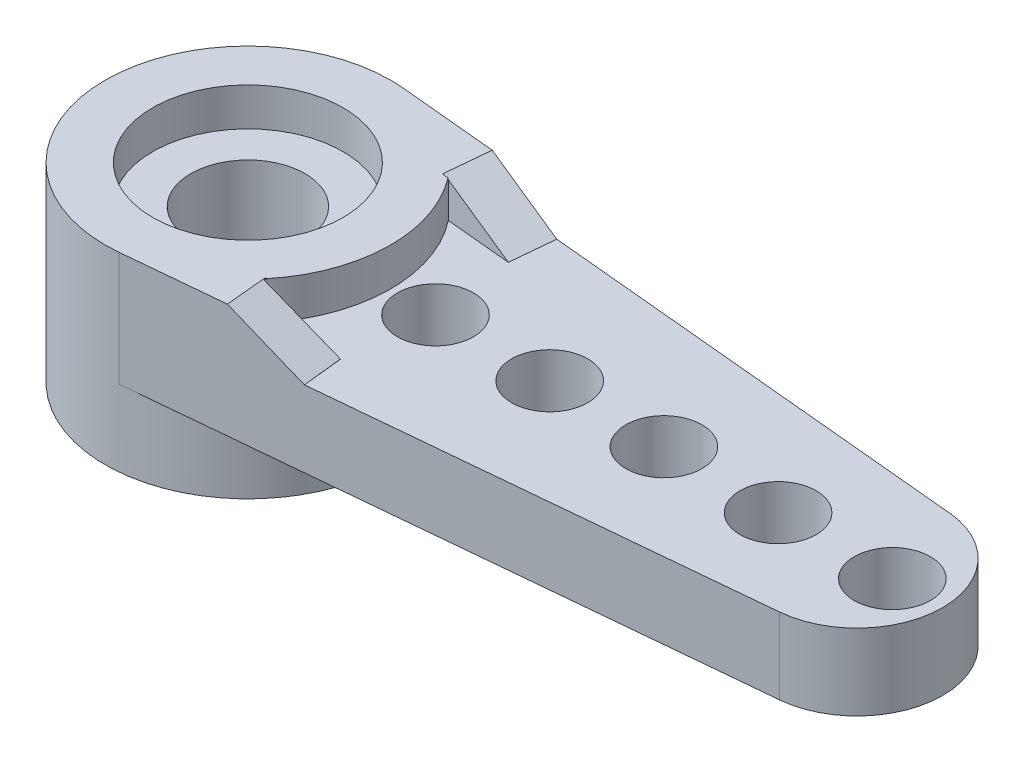
ISO-10303-21;
HEADER;
FILE_DESCRIPTION(('STEP AP214'),'2;1');
FILE_NAME('part.step','',(''),(''),'','','');
FILE_SCHEMA(('AUTOMOTIVE_DESIGN { 1 0 10303 214 1 1 1 1 }'));
ENDSEC;
DATA;
#1=APPLICATION_CONTEXT('core data for automotive mechanical design processes');
#2=APPLICATION_PROTOCOL_DEFINITION('international standard','automotive_design',2000,#1);
#3=PRODUCT_CONTEXT('',#1,'mechanical');
#4=PRODUCT('Part','Part','',(#3));
#5=PRODUCT_RELATED_PRODUCT_CATEGORY('part','',(#4));
#6=PRODUCT_DEFINITION_FORMATION('','',#4);
#7=PRODUCT_DEFINITION_CONTEXT('part definition',#1,'design');
#8=PRODUCT_DEFINITION('design','',#6,#7);
#9=PRODUCT_DEFINITION_SHAPE('','',#8);
#10=(LENGTH_UNIT() NAMED_UNIT(*) SI_UNIT(.MILLI.,.METRE.));
#11=(NAMED_UNIT(*) PLANE_ANGLE_UNIT() SI_UNIT($,.RADIAN.));
#12=(NAMED_UNIT(*) SI_UNIT($,.STERADIAN.) SOLID_ANGLE_UNIT());
#13=UNCERTAINTY_MEASURE_WITH_UNIT(LENGTH_MEASURE(1.E-05),#10,'distance_accuracy_value','');
#14=(GEOMETRIC_REPRESENTATION_CONTEXT(3) GLOBAL_UNCERTAINTY_ASSIGNED_CONTEXT((#13)) GLOBAL_UNIT_ASSIGNED_CONTEXT((#10,
#11,#12)) REPRESENTATION_CONTEXT('',''));
#15=CARTESIAN_POINT('',(0.,0.,0.));
#16=DIRECTION('',(0.,0.,1.));
#17=DIRECTION('',(1.,0.,0.));
#18=AXIS2_PLACEMENT_3D('',#15,#16,#17);
#19=CARTESIAN_POINT('',(0.,2.,0.));
#20=DIRECTION('',(0.,-1.,0.));
#21=DIRECTION('',(0.,0.,-1.));
#22=AXIS2_PLACEMENT_3D('',#19,#20,#21);
#23=CYLINDRICAL_SURFACE('',#22,3.75);
#24=CARTESIAN_POINT('',(0.,-2.,0.));
#25=DIRECTION('',(0.,-1.,0.));
#26=DIRECTION('',(0.,0.,-1.));
#27=AXIS2_PLACEMENT_3D('',#24,#25,#26);
#28=CIRCLE('',#27,3.75);
#29=CARTESIAN_POINT('',(0.,-2.,-3.75));
#30=VERTEX_POINT('',#29);
#31=EDGE_CURVE('E247',#30,#30,#28,.T.);
#32=ORIENTED_EDGE('',*,*,#31,.F.);
#33=EDGE_LOOP('',(#32));
#34=FACE_BOUND('',#33,.T.);
#35=DIRECTION('',(0.,-1.,0.));
#36=VECTOR('',#35,1.);
#37=CARTESIAN_POINT('',(0.3515625,2.,3.73348413798609));
#38=LINE('',#37,#36);
#39=CARTESIAN_POINT('',(0.3515625,3.,3.73348413798609));
#40=VERTEX_POINT('',#39);
#41=CARTESIAN_POINT('',(0.3515625,0.,3.73348413798609));
#42=VERTEX_POINT('',#41);
#43=EDGE_CURVE('E45',#40,#42,#38,.T.);
#44=ORIENTED_EDGE('',*,*,#43,.F.);
#45=CARTESIAN_POINT('',(0.,3.,0.));
#46=DIRECTION('',(0.,1.,0.));
#47=DIRECTION('',(0.,0.,1.));
#48=AXIS2_PLACEMENT_3D('',#45,#46,#47);
#49=CIRCLE('',#48,3.75);
#50=CARTESIAN_POINT('',(0.3515625,3.,-3.73348413798609));
#51=VERTEX_POINT('',#50);
#52=EDGE_CURVE('E258',#51,#40,#49,.T.);
#53=ORIENTED_EDGE('',*,*,#52,.F.);
#54=DIRECTION('',(0.,-1.,0.));
#55=VECTOR('',#54,1.);
#56=CARTESIAN_POINT('',(0.3515625,2.,-3.73348413798609));
#57=LINE('',#56,#55);
#58=CARTESIAN_POINT('',(0.3515625,0.,-3.73348413798609));
#59=VERTEX_POINT('',#58);
#60=EDGE_CURVE('E273',#51,#59,#57,.T.);
#61=ORIENTED_EDGE('',*,*,#60,.T.);
#62=CARTESIAN_POINT('',(0.,0.,0.));
#63=DIRECTION('',(0.,-1.,0.));
#64=DIRECTION('',(0.,0.,-1.));
#65=AXIS2_PLACEMENT_3D('',#62,#63,#64);
#66=CIRCLE('',#65,3.75);
#67=EDGE_CURVE('E244',#59,#42,#66,.T.);
#68=ORIENTED_EDGE('',*,*,#67,.T.);
#69=EDGE_LOOP('',(#44,#53,#61,#68));
#70=FACE_BOUND('',#69,.T.);
#71=ADVANCED_FACE('F38',(#34,#70),#23,.T.);
#72=DIRECTION('',(0.,-1.,0.));
#73=VECTOR('',#72,1.);
#74=CARTESIAN_POINT('',(2.95007757756407,3.,-2.31506852735588));
#75=LINE('',#74,#73);
#76=CARTESIAN_POINT('',(2.95007757756407,2.92895565400102,-2.31506852735588));
#77=VERTEX_POINT('',#76);
#78=CARTESIAN_POINT('',(2.95007757756407,2.,-2.31506852735588));
#79=VERTEX_POINT('',#78);
#80=EDGE_CURVE('E198',#77,#79,#75,.T.);
#81=ORIENTED_EDGE('',*,*,#80,.F.);
#82=CARTESIAN_POINT('',(0.,4.37509868074712,0.));
#83=DIRECTION('',(-0.467370729085676,-0.882965308487425,-0.0440098352829255));
#84=DIRECTION('',(0.879076526301279,-0.469438243017872,0.0827779976706961));
#85=AXIS2_PLACEMENT_3D('',#82,#83,#84);
#86=ELLIPSE('',#85,4.24705247641494,3.75);
#87=CARTESIAN_POINT('',(2.97649828691811,2.91327253963519,-2.28099933098928));
#88=VERTEX_POINT('',#87);
#89=EDGE_CURVE('E163',#77,#88,#86,.T.);
#90=ORIENTED_EDGE('',*,*,#89,.T.);
#91=DIRECTION('',(0.,-1.,0.));
#92=VECTOR('',#91,1.);
#93=CARTESIAN_POINT('',(2.97649828691811,2.,-2.28099933098928));
#94=LINE('',#93,#92);
#95=CARTESIAN_POINT('',(2.97649828691811,3.,-2.28099933098928));
#96=VERTEX_POINT('',#95);
#97=EDGE_CURVE('E140',#96,#88,#94,.T.);
#98=ORIENTED_EDGE('',*,*,#97,.F.);
#99=CARTESIAN_POINT('',(2.89005158990791,3.,2.38958193156685));
#100=VERTEX_POINT('',#99);
#101=EDGE_CURVE('E157',#100,#96,#49,.T.);
#102=ORIENTED_EDGE('',*,*,#101,.F.);
#103=DIRECTION('',(0.,-1.,0.));
#104=VECTOR('',#103,1.);
#105=CARTESIAN_POINT('',(2.89005158990791,2.,2.38958193156685));
#106=LINE('',#105,#104);
#107=CARTESIAN_POINT('',(2.89005158990791,2.97681869407781,2.38958193156685));
#108=VERTEX_POINT('',#107);
#109=EDGE_CURVE('E52',#100,#108,#106,.T.);
#110=ORIENTED_EDGE('',*,*,#109,.T.);
#111=CARTESIAN_POINT('',(0.,4.40557693455155,0.));
#112=DIRECTION('',(-0.472026717856812,-0.880463019866336,0.0444482651762517));
#113=DIRECTION('',(0.876585258334479,-0.474114828546685,-0.0825434081124689));
#114=AXIS2_PLACEMENT_3D('',#111,#112,#113);
#115=ELLIPSE('',#114,4.25912266090323,3.75);
#116=CARTESIAN_POINT('',(2.85116823930113,3.,2.4358447551518));
#117=VERTEX_POINT('',#116);
#118=EDGE_CURVE('E176',#108,#117,#115,.T.);
#119=ORIENTED_EDGE('',*,*,#118,.T.);
#120=CARTESIAN_POINT('',(2.83824462724178,3.,2.45089115138416));
#121=VERTEX_POINT('',#120);
#122=EDGE_CURVE('E262',#121,#117,#49,.T.);
#123=ORIENTED_EDGE('',*,*,#122,.F.);
#124=DIRECTION('',(0.,-1.,0.));
#125=VECTOR('',#124,1.);
#126=CARTESIAN_POINT('',(2.83824462724178,3.,2.45089115138416));
#127=LINE('',#126,#125);
#128=CARTESIAN_POINT('',(2.83824462724178,2.,2.45089115138416));
#129=VERTEX_POINT('',#128);
#130=EDGE_CURVE('E187',#121,#129,#127,.T.);
#131=ORIENTED_EDGE('',*,*,#130,.T.);
#132=CARTESIAN_POINT('',(0.,2.,0.));
#133=DIRECTION('',(0.,1.,0.));
#134=DIRECTION('',(0.,0.,1.));
#135=AXIS2_PLACEMENT_3D('',#132,#133,#134);
#136=CIRCLE('',#135,3.75);
#137=EDGE_CURVE('E255',#129,#79,#136,.T.);
#138=ORIENTED_EDGE('',*,*,#137,.T.);
#139=EDGE_LOOP('',(#81,#90,#98,#102,#110,#119,#123,#131,#138));
#140=FACE_BOUND('',#139,.T.);
#141=ADVANCED_FACE('F330',(#140),#23,.T.);
#142=CARTESIAN_POINT('',(0.,2.,0.));
#143=DIRECTION('',(0.,1.,0.));
#144=DIRECTION('',(0.,0.,1.));
#145=AXIS2_PLACEMENT_3D('',#142,#143,#144);
#146=PLANE('',#145);
#147=DIRECTION('',(0.0937500000000001,0.,-0.995595770129624));
#148=VECTOR('',#147,1.);
#149=CARTESIAN_POINT('',(4.79920503647405,2.,-3.31467311015283));
#150=LINE('',#149,#148);
#151=CARTESIAN_POINT('',(4.68965274331396,2.,-2.15126191358549));
#152=VERTEX_POINT('',#151);
#153=CARTESIAN_POINT('',(4.79920503647405,2.,-3.31467311015283));
#154=VERTEX_POINT('',#153);
#155=EDGE_CURVE('E199',#152,#154,#150,.T.);
#156=ORIENTED_EDGE('',*,*,#155,.F.);
#157=DIRECTION('',(0.995595770129624,0.,0.09375));
#158=VECTOR('',#157,1.);
#159=CARTESIAN_POINT('',(4.68965274331396,2.,-2.15126191358549));
#160=LINE('',#159,#158);
#161=EDGE_CURVE('E195',#79,#152,#160,.T.);
#162=ORIENTED_EDGE('',*,*,#161,.F.);
#163=ORIENTED_EDGE('',*,*,#137,.F.);
#164=DIRECTION('',(-0.994660521333252,0.,0.103201004360725));
#165=VECTOR('',#164,1.);
#166=CARTESIAN_POINT('',(4.68965274331396,2.,2.25879829863462));
#167=LINE('',#166,#165);
#168=CARTESIAN_POINT('',(4.68965274331396,2.,2.25879829863462));
#169=VERTEX_POINT('',#168);
#170=EDGE_CURVE('E185',#169,#129,#167,.T.);
#171=ORIENTED_EDGE('',*,*,#170,.F.);
#172=DIRECTION('',(-0.103201004360725,0.,-0.994660521333253));
#173=VECTOR('',#172,1.);
#174=CARTESIAN_POINT('',(4.79920503647405,2.,3.31467311015283));
#175=LINE('',#174,#173);
#176=CARTESIAN_POINT('',(4.79920503647405,2.,3.31467311015283));
#177=VERTEX_POINT('',#176);
#178=EDGE_CURVE('E180',#177,#169,#175,.T.);
#179=ORIENTED_EDGE('',*,*,#178,.F.);
#180=DIRECTION('',(0.995595770129625,0.,-0.0937499999999999));
#181=VECTOR('',#180,1.);
#182=CARTESIAN_POINT('',(0.3515625,2.,3.73348413798609));
#183=LINE('',#182,#181);
#184=CARTESIAN_POINT('',(16.2109375,2.,2.24009048279166));
#185=VERTEX_POINT('',#184);
#186=EDGE_CURVE('E265',#177,#185,#183,.T.);
#187=ORIENTED_EDGE('',*,*,#186,.T.);
#188=CARTESIAN_POINT('',(16.,2.,0.));
#189=DIRECTION('',(0.,1.,0.));
#190=DIRECTION('',(0.,0.,1.));
#191=AXIS2_PLACEMENT_3D('',#188,#189,#190);
#192=CIRCLE('',#191,2.25);
#193=CARTESIAN_POINT('',(16.2109375,2.,-2.24009048279166));
#194=VERTEX_POINT('',#193);
#195=EDGE_CURVE('E267',#185,#194,#192,.T.);
#196=ORIENTED_EDGE('',*,*,#195,.T.);
#197=DIRECTION('',(0.995595770129624,0.,0.09375));
#198=VECTOR('',#197,1.);
#199=CARTESIAN_POINT('',(0.3515625,2.,-3.73348413798609));
#200=LINE('',#199,#198);
#201=EDGE_CURVE('E271',#154,#194,#200,.T.);
#202=ORIENTED_EDGE('',*,*,#201,.F.);
#203=EDGE_LOOP('',(#156,#162,#163,#171,#179,#187,#196,#202));
#204=FACE_BOUND('',#203,.T.);
#205=CARTESIAN_POINT('',(4.92748738020224,2.,0.));
#206=DIRECTION('',(0.,1.,0.));
#207=DIRECTION('',(0.,0.,1.));
#208=AXIS2_PLACEMENT_3D('',#205,#206,#207);
#209=CIRCLE('',#208,1.);
#210=CARTESIAN_POINT('',(4.92748738020224,2.,1.));
#211=VERTEX_POINT('',#210);
#212=EDGE_CURVE('E215',#211,#211,#209,.T.);
#213=ORIENTED_EDGE('',*,*,#212,.F.);
#214=EDGE_LOOP('',(#213));
#215=FACE_BOUND('',#214,.T.);
#216=CARTESIAN_POINT('',(7.92748738020224,2.,0.));
#217=DIRECTION('',(0.,1.,0.));
#218=DIRECTION('',(0.,0.,1.));
#219=AXIS2_PLACEMENT_3D('',#216,#217,#218);
#220=CIRCLE('',#219,1.00000000000001);
#221=CARTESIAN_POINT('',(7.92748738020224,2.,1.00000000000001));
#222=VERTEX_POINT('',#221);
#223=EDGE_CURVE('E221',#222,#222,#220,.T.);
#224=ORIENTED_EDGE('',*,*,#223,.F.);
#225=EDGE_LOOP('',(#224));
#226=FACE_BOUND('',#225,.T.);
#227=CARTESIAN_POINT('',(10.9274873802022,2.,0.));
#228=DIRECTION('',(0.,1.,0.));
#229=DIRECTION('',(0.,0.,1.));
#230=AXIS2_PLACEMENT_3D('',#227,#228,#229);
#231=CIRCLE('',#230,1.);
#232=CARTESIAN_POINT('',(10.9274873802022,2.,1.));
#233=VERTEX_POINT('',#232);
#234=EDGE_CURVE('E227',#233,#233,#231,.T.);
#235=ORIENTED_EDGE('',*,*,#234,.F.);
#236=EDGE_LOOP('',(#235));
#237=FACE_BOUND('',#236,.T.);
#238=CARTESIAN_POINT('',(13.9274873802022,2.,0.));
#239=DIRECTION('',(0.,1.,0.));
#240=DIRECTION('',(0.,0.,1.));
#241=AXIS2_PLACEMENT_3D('',#238,#239,#240);
#242=CIRCLE('',#241,1.);
#243=CARTESIAN_POINT('',(13.9274873802022,2.,1.));
#244=VERTEX_POINT('',#243);
#245=EDGE_CURVE('E233',#244,#244,#242,.T.);
#246=ORIENTED_EDGE('',*,*,#245,.F.);
#247=EDGE_LOOP('',(#246));
#248=FACE_BOUND('',#247,.T.);
#249=CARTESIAN_POINT('',(16.9274873802022,2.,0.));
#250=DIRECTION('',(0.,1.,0.));
#251=DIRECTION('',(0.,0.,1.));
#252=AXIS2_PLACEMENT_3D('',#249,#250,#251);
#253=CIRCLE('',#252,1.);
#254=CARTESIAN_POINT('',(16.9274873802022,2.,1.));
#255=VERTEX_POINT('',#254);
#256=EDGE_CURVE('E204',#255,#255,#253,.T.);
#257=ORIENTED_EDGE('',*,*,#256,.F.);
#258=EDGE_LOOP('',(#257));
#259=FACE_BOUND('',#258,.T.);
#260=ADVANCED_FACE('F308',(#204,#215,#226,#237,#248,#259),#146,.T.);
#261=CARTESIAN_POINT('',(0.3515625,2.,3.73348413798609));
#262=DIRECTION('',(-0.0937499999999999,0.,-0.995595770129625));
#263=DIRECTION('',(-0.995595770129625,0.,0.0937499999999999));
#264=AXIS2_PLACEMENT_3D('',#261,#262,#263);
#265=PLANE('',#264);
#266=ORIENTED_EDGE('',*,*,#186,.F.);
#267=DIRECTION('',(0.876585258334479,-0.474114828546685,-0.0825434081124689));
#268=VECTOR('',#267,1.);
#269=CARTESIAN_POINT('',(2.950316949549,3.,3.48877314487541));
#270=LINE('',#269,#268);
#271=CARTESIAN_POINT('',(2.950316949549,3.,3.48877314487541));
#272=VERTEX_POINT('',#271);
#273=EDGE_CURVE('E166',#272,#177,#270,.T.);
#274=ORIENTED_EDGE('',*,*,#273,.F.);
#275=DIRECTION('',(0.995595770129625,0.,-0.0937499999999999));
#276=VECTOR('',#275,1.);
#277=CARTESIAN_POINT('',(0.3515625,3.,3.73348413798609));
#278=LINE('',#277,#276);
#279=EDGE_CURVE('E181',#40,#272,#278,.T.);
#280=ORIENTED_EDGE('',*,*,#279,.F.);
#281=ORIENTED_EDGE('',*,*,#43,.T.);
#282=DIRECTION('',(0.995595770129625,0.,-0.0937499999999999));
#283=VECTOR('',#282,1.);
#284=CARTESIAN_POINT('',(0.3515625,0.,3.73348413798609));
#285=LINE('',#284,#283);
#286=CARTESIAN_POINT('',(16.2109375,0.,2.24009048279166));
#287=VERTEX_POINT('',#286);
#288=EDGE_CURVE('E261',#42,#287,#285,.T.);
#289=ORIENTED_EDGE('',*,*,#288,.T.);
#290=DIRECTION('',(0.,-1.,0.));
#291=VECTOR('',#290,1.);
#292=CARTESIAN_POINT('',(16.2109375,2.,2.24009048279166));
#293=LINE('',#292,#291);
#294=EDGE_CURVE('E284',#185,#287,#293,.T.);
#295=ORIENTED_EDGE('',*,*,#294,.F.);
#296=EDGE_LOOP('',(#266,#274,#280,#281,#289,#295));
#297=FACE_BOUND('',#296,.T.);
#298=ADVANCED_FACE('F290',(#297),#265,.F.);
#299=CARTESIAN_POINT('',(16.,2.,0.));
#300=DIRECTION('',(0.,-1.,0.));
#301=DIRECTION('',(0.,0.,-1.));
#302=AXIS2_PLACEMENT_3D('',#299,#300,#301);
#303=CYLINDRICAL_SURFACE('',#302,2.25);
#304=CARTESIAN_POINT('',(16.,0.,0.));
#305=DIRECTION('',(0.,1.,0.));
#306=DIRECTION('',(0.,0.,1.));
#307=AXIS2_PLACEMENT_3D('',#304,#305,#306);
#308=CIRCLE('',#307,2.25);
#309=CARTESIAN_POINT('',(16.2109375,0.,-2.24009048279166));
#310=VERTEX_POINT('',#309);
#311=EDGE_CURVE('E275',#287,#310,#308,.T.);
#312=ORIENTED_EDGE('',*,*,#311,.T.);
#313=DIRECTION('',(0.,-1.,0.));
#314=VECTOR('',#313,1.);
#315=CARTESIAN_POINT('',(16.2109375,2.,-2.24009048279166));
#316=LINE('',#315,#314);
#317=EDGE_CURVE('E282',#194,#310,#316,.T.);
#318=ORIENTED_EDGE('',*,*,#317,.F.);
#319=ORIENTED_EDGE('',*,*,#195,.F.);
#320=ORIENTED_EDGE('',*,*,#294,.T.);
#321=EDGE_LOOP('',(#312,#318,#319,#320));
#322=FACE_BOUND('',#321,.T.);
#323=ADVANCED_FACE('F303',(#322),#303,.T.);
#324=CARTESIAN_POINT('',(0.3515625,2.,-3.73348413798609));
#325=DIRECTION('',(0.09375,0.,-0.995595770129625));
#326=DIRECTION('',(-0.995595770129625,0.,-0.09375));
#327=AXIS2_PLACEMENT_3D('',#324,#325,#326);
#328=PLANE('',#327);
#329=DIRECTION('',(-0.879076526301279,0.469438243017872,-0.082777997670696));
#330=VECTOR('',#329,1.);
#331=CARTESIAN_POINT('',(2.92659124887556,3.,-3.49100726890935));
#332=LINE('',#331,#330);
#333=CARTESIAN_POINT('',(2.92659124887556,3.,-3.49100726890935));
#334=VERTEX_POINT('',#333);
#335=EDGE_CURVE('E148',#154,#334,#332,.T.);
#336=ORIENTED_EDGE('',*,*,#335,.F.);
#337=ORIENTED_EDGE('',*,*,#201,.T.);
#338=ORIENTED_EDGE('',*,*,#317,.T.);
#339=DIRECTION('',(0.995595770129624,0.,0.09375));
#340=VECTOR('',#339,1.);
#341=CARTESIAN_POINT('',(0.3515625,0.,-3.73348413798609));
#342=LINE('',#341,#340);
#343=EDGE_CURVE('E268',#59,#310,#342,.T.);
#344=ORIENTED_EDGE('',*,*,#343,.F.);
#345=ORIENTED_EDGE('',*,*,#60,.F.);
#346=DIRECTION('',(-0.995595770129625,0.,-0.0937499999999999));
#347=VECTOR('',#346,1.);
#348=CARTESIAN_POINT('',(0.3515625,3.,-3.73348413798609));
#349=LINE('',#348,#347);
#350=EDGE_CURVE('E196',#334,#51,#349,.T.);
#351=ORIENTED_EDGE('',*,*,#350,.F.);
#352=EDGE_LOOP('',(#336,#337,#338,#344,#345,#351));
#353=FACE_BOUND('',#352,.T.);
#354=ADVANCED_FACE('F324',(#353),#328,.T.);
#355=CARTESIAN_POINT('',(0.,0.,0.));
#356=DIRECTION('',(0.,1.,0.));
#357=DIRECTION('',(0.,0.,1.));
#358=AXIS2_PLACEMENT_3D('',#355,#356,#357);
#359=PLANE('',#358);
#360=CARTESIAN_POINT('',(4.92748738020224,0.,0.));
#361=DIRECTION('',(0.,1.,0.));
#362=DIRECTION('',(0.,0.,1.));
#363=AXIS2_PLACEMENT_3D('',#360,#361,#362);
#364=CIRCLE('',#363,1.);
#365=CARTESIAN_POINT('',(4.92748738020224,0.,1.));
#366=VERTEX_POINT('',#365);
#367=EDGE_CURVE('E212',#366,#366,#364,.T.);
#368=ORIENTED_EDGE('',*,*,#367,.T.);
#369=EDGE_LOOP('',(#368));
#370=FACE_BOUND('',#369,.T.);
#371=CARTESIAN_POINT('',(7.92748738020224,0.,0.));
#372=DIRECTION('',(0.,1.,0.));
#373=DIRECTION('',(0.,0.,1.));
#374=AXIS2_PLACEMENT_3D('',#371,#372,#373);
#375=CIRCLE('',#374,1.00000000000001);
#376=CARTESIAN_POINT('',(7.92748738020224,0.,1.00000000000001));
#377=VERTEX_POINT('',#376);
#378=EDGE_CURVE('E218',#377,#377,#375,.T.);
#379=ORIENTED_EDGE('',*,*,#378,.T.);
#380=EDGE_LOOP('',(#379));
#381=FACE_BOUND('',#380,.T.);
#382=CARTESIAN_POINT('',(10.9274873802022,0.,0.));
#383=DIRECTION('',(0.,1.,0.));
#384=DIRECTION('',(0.,0.,1.));
#385=AXIS2_PLACEMENT_3D('',#382,#383,#384);
#386=CIRCLE('',#385,1.);
#387=CARTESIAN_POINT('',(10.9274873802022,0.,1.));
#388=VERTEX_POINT('',#387);
#389=EDGE_CURVE('E224',#388,#388,#386,.T.);
#390=ORIENTED_EDGE('',*,*,#389,.T.);
#391=EDGE_LOOP('',(#390));
#392=FACE_BOUND('',#391,.T.);
#393=CARTESIAN_POINT('',(13.9274873802022,0.,0.));
#394=DIRECTION('',(0.,1.,0.));
#395=DIRECTION('',(0.,0.,1.));
#396=AXIS2_PLACEMENT_3D('',#393,#394,#395);
#397=CIRCLE('',#396,1.);
#398=CARTESIAN_POINT('',(13.9274873802022,0.,1.));
#399=VERTEX_POINT('',#398);
#400=EDGE_CURVE('E230',#399,#399,#397,.T.);
#401=ORIENTED_EDGE('',*,*,#400,.T.);
#402=EDGE_LOOP('',(#401));
#403=FACE_BOUND('',#402,.T.);
#404=CARTESIAN_POINT('',(16.9274873802022,0.,0.));
#405=DIRECTION('',(0.,1.,0.));
#406=DIRECTION('',(0.,0.,1.));
#407=AXIS2_PLACEMENT_3D('',#404,#405,#406);
#408=CIRCLE('',#407,1.);
#409=CARTESIAN_POINT('',(16.9274873802022,0.,1.));
#410=VERTEX_POINT('',#409);
#411=EDGE_CURVE('E236',#410,#410,#408,.T.);
#412=ORIENTED_EDGE('',*,*,#411,.T.);
#413=EDGE_LOOP('',(#412));
#414=FACE_BOUND('',#413,.T.);
#415=ORIENTED_EDGE('',*,*,#67,.F.);
#416=ORIENTED_EDGE('',*,*,#343,.T.);
#417=ORIENTED_EDGE('',*,*,#311,.F.);
#418=ORIENTED_EDGE('',*,*,#288,.F.);
#419=EDGE_LOOP('',(#415,#416,#417,#418));
#420=FACE_BOUND('',#419,.T.);
#421=ADVANCED_FACE('F300',(#370,#381,#392,#403,#414,#420),#359,.F.);
#422=CARTESIAN_POINT('',(0.,3.,0.));
#423=DIRECTION('',(0.,1.,0.));
#424=DIRECTION('',(0.,0.,1.));
#425=AXIS2_PLACEMENT_3D('',#422,#423,#424);
#426=PLANE('',#425);
#427=DIRECTION('',(0.09375,0.,-0.995595770129625));
#428=VECTOR('',#427,1.);
#429=CARTESIAN_POINT('',(2.81409124887556,3.,-2.2962923447538));
#430=LINE('',#429,#428);
#431=CARTESIAN_POINT('',(2.81409124887556,3.,-2.2962923447538));
#432=VERTEX_POINT('',#431);
#433=EDGE_CURVE('E143',#432,#334,#430,.T.);
#434=ORIENTED_EDGE('',*,*,#433,.T.);
#435=ORIENTED_EDGE('',*,*,#350,.T.);
#436=ORIENTED_EDGE('',*,*,#52,.T.);
#437=ORIENTED_EDGE('',*,*,#279,.T.);
#438=DIRECTION('',(0.0937499999999999,0.,0.995595770129625));
#439=VECTOR('',#438,1.);
#440=CARTESIAN_POINT('',(2.847191949549,3.,2.39361779773282));
#441=LINE('',#440,#439);
#442=CARTESIAN_POINT('',(2.85244632755698,3.,2.44941765393983));
#443=VERTEX_POINT('',#442);
#444=EDGE_CURVE('E171',#443,#272,#441,.T.);
#445=ORIENTED_EDGE('',*,*,#444,.F.);
#446=DIRECTION('',(-0.994660521333252,0.,0.103201004360725));
#447=VECTOR('',#446,1.);
#448=CARTESIAN_POINT('',(4.68965274331396,3.,2.25879829863462));
#449=LINE('',#448,#447);
#450=EDGE_CURVE('E184',#443,#121,#449,.T.);
#451=ORIENTED_EDGE('',*,*,#450,.T.);
#452=ORIENTED_EDGE('',*,*,#122,.T.);
#453=CARTESIAN_POINT('',(2.847191949549,3.,2.39361779773282));
#454=VERTEX_POINT('',#453);
#455=EDGE_CURVE('E173',#454,#117,#441,.T.);
#456=ORIENTED_EDGE('',*,*,#455,.F.);
#457=DIRECTION('',(-0.995595770129624,0.,0.0937499999999999));
#458=VECTOR('',#457,1.);
#459=CARTESIAN_POINT('',(4.69608003647405,3.,2.21951776301024));
#460=LINE('',#459,#458);
#461=EDGE_CURVE('E167',#100,#454,#460,.T.);
#462=ORIENTED_EDGE('',*,*,#461,.F.);
#463=ORIENTED_EDGE('',*,*,#101,.T.);
#464=DIRECTION('',(0.995595770129624,0.,0.0937499999999999));
#465=VECTOR('',#464,1.);
#466=CARTESIAN_POINT('',(4.68670503647405,3.,-2.11995818599728));
#467=LINE('',#466,#465);
#468=EDGE_CURVE('E138',#432,#96,#467,.T.);
#469=ORIENTED_EDGE('',*,*,#468,.F.);
#470=EDGE_LOOP('',(#434,#435,#436,#437,#445,#451,#452,#456,#462,#463,#469));
#471=FACE_BOUND('',#470,.T.);
#472=CARTESIAN_POINT('',(0.,3.,0.));
#473=DIRECTION('',(0.,1.,0.));
#474=DIRECTION('',(0.,0.,1.));
#475=AXIS2_PLACEMENT_3D('',#472,#473,#474);
#476=CIRCLE('',#475,2.5);
#477=CARTESIAN_POINT('',(0.,3.,2.5));
#478=VERTEX_POINT('',#477);
#479=EDGE_CURVE('E252',#478,#478,#476,.T.);
#480=ORIENTED_EDGE('',*,*,#479,.F.);
#481=EDGE_LOOP('',(#480));
#482=FACE_BOUND('',#481,.T.);
#483=ADVANCED_FACE('F154',(#471,#482),#426,.T.);
#484=CARTESIAN_POINT('',(0.,3.,0.));
#485=DIRECTION('',(0.,-1.,0.));
#486=DIRECTION('',(0.,0.,-1.));
#487=AXIS2_PLACEMENT_3D('',#484,#485,#486);
#488=CYLINDRICAL_SURFACE('',#487,2.5);
#489=ORIENTED_EDGE('',*,*,#479,.T.);
#490=EDGE_LOOP('',(#489));
#491=FACE_BOUND('',#490,.T.);
#492=CARTESIAN_POINT('',(0.,2.,0.));
#493=DIRECTION('',(0.,1.,0.));
#494=DIRECTION('',(0.,0.,1.));
#495=AXIS2_PLACEMENT_3D('',#492,#493,#494);
#496=CIRCLE('',#495,2.5);
#497=CARTESIAN_POINT('',(0.,2.,2.5));
#498=VERTEX_POINT('',#497);
#499=EDGE_CURVE('E250',#498,#498,#496,.T.);
#500=ORIENTED_EDGE('',*,*,#499,.F.);
#501=EDGE_LOOP('',(#500));
#502=FACE_BOUND('',#501,.T.);
#503=ADVANCED_FACE('F384',(#491,#502),#488,.F.);
#504=CARTESIAN_POINT('',(0.,2.,0.));
#505=DIRECTION('',(0.,1.,0.));
#506=DIRECTION('',(0.,0.,1.));
#507=AXIS2_PLACEMENT_3D('',#504,#505,#506);
#508=CIRCLE('',#507,1.5);
#509=CARTESIAN_POINT('',(0.,2.,1.5));
#510=VERTEX_POINT('',#509);
#511=EDGE_CURVE('E209',#510,#510,#508,.T.);
#512=ORIENTED_EDGE('',*,*,#511,.F.);
#513=EDGE_LOOP('',(#512));
#514=FACE_BOUND('',#513,.T.);
#515=ORIENTED_EDGE('',*,*,#499,.T.);
#516=EDGE_LOOP('',(#515));
#517=FACE_BOUND('',#516,.T.);
#518=ADVANCED_FACE('F356',(#514,#517),#146,.T.);
#519=CARTESIAN_POINT('',(0.,-2.,0.));
#520=DIRECTION('',(0.,-1.,0.));
#521=DIRECTION('',(0.,0.,-1.));
#522=AXIS2_PLACEMENT_3D('',#519,#520,#521);
#523=PLANE('',#522);
#524=ORIENTED_EDGE('',*,*,#31,.T.);
#525=EDGE_LOOP('',(#524));
#526=FACE_BOUND('',#525,.T.);
#527=CARTESIAN_POINT('',(0.,-2.,0.));
#528=DIRECTION('',(0.,-1.,0.));
#529=DIRECTION('',(0.,0.,-1.));
#530=AXIS2_PLACEMENT_3D('',#527,#528,#529);
#531=CIRCLE('',#530,2.5);
#532=CARTESIAN_POINT('',(0.,-2.,-2.5));
#533=VERTEX_POINT('',#532);
#534=EDGE_CURVE('E241',#533,#533,#531,.T.);
#535=ORIENTED_EDGE('',*,*,#534,.F.);
#536=EDGE_LOOP('',(#535));
#537=FACE_BOUND('',#536,.T.);
#538=ADVANCED_FACE('F352',(#526,#537),#523,.T.);
#539=CARTESIAN_POINT('',(0.,-2.,0.));
#540=DIRECTION('',(0.,1.,0.));
#541=DIRECTION('',(0.,0.,1.));
#542=AXIS2_PLACEMENT_3D('',#539,#540,#541);
#543=CYLINDRICAL_SURFACE('',#542,2.5);
#544=ORIENTED_EDGE('',*,*,#534,.T.);
#545=EDGE_LOOP('',(#544));
#546=FACE_BOUND('',#545,.T.);
#547=CARTESIAN_POINT('',(0.,0.,0.));
#548=DIRECTION('',(0.,-1.,0.));
#549=DIRECTION('',(0.,0.,-1.));
#550=AXIS2_PLACEMENT_3D('',#547,#548,#549);
#551=CIRCLE('',#550,2.5);
#552=CARTESIAN_POINT('',(0.,0.,-2.5));
#553=VERTEX_POINT('',#552);
#554=EDGE_CURVE('E208',#553,#553,#551,.T.);
#555=ORIENTED_EDGE('',*,*,#554,.F.);
#556=EDGE_LOOP('',(#555));
#557=FACE_BOUND('',#556,.T.);
#558=ADVANCED_FACE('F355',(#546,#557),#543,.F.);
#559=CARTESIAN_POINT('',(0.,0.,0.));
#560=DIRECTION('',(0.,1.,0.));
#561=DIRECTION('',(0.,0.,1.));
#562=AXIS2_PLACEMENT_3D('',#559,#560,#561);
#563=CIRCLE('',#562,1.5);
#564=CARTESIAN_POINT('',(0.,0.,1.5));
#565=VERTEX_POINT('',#564);
#566=EDGE_CURVE('E205',#565,#565,#563,.T.);
#567=ORIENTED_EDGE('',*,*,#566,.T.);
#568=EDGE_LOOP('',(#567));
#569=FACE_BOUND('',#568,.T.);
#570=ORIENTED_EDGE('',*,*,#554,.T.);
#571=EDGE_LOOP('',(#570));
#572=FACE_BOUND('',#571,.T.);
#573=ADVANCED_FACE('F362',(#569,#572),#359,.F.);
#574=CARTESIAN_POINT('',(16.9274873802022,0.,0.));
#575=DIRECTION('',(0.,1.,0.));
#576=DIRECTION('',(0.,0.,1.));
#577=AXIS2_PLACEMENT_3D('',#574,#575,#576);
#578=CYLINDRICAL_SURFACE('',#577,1.);
#579=ORIENTED_EDGE('',*,*,#411,.F.);
#580=EDGE_LOOP('',(#579));
#581=FACE_BOUND('',#580,.T.);
#582=ORIENTED_EDGE('',*,*,#256,.T.);
#583=EDGE_LOOP('',(#582));
#584=FACE_BOUND('',#583,.T.);
#585=ADVANCED_FACE('F367',(#581,#584),#578,.F.);
#586=CARTESIAN_POINT('',(13.9274873802022,0.,0.));
#587=DIRECTION('',(0.,1.,0.));
#588=DIRECTION('',(0.,0.,1.));
#589=AXIS2_PLACEMENT_3D('',#586,#587,#588);
#590=CYLINDRICAL_SURFACE('',#589,1.);
#591=ORIENTED_EDGE('',*,*,#400,.F.);
#592=EDGE_LOOP('',(#591));
#593=FACE_BOUND('',#592,.T.);
#594=ORIENTED_EDGE('',*,*,#245,.T.);
#595=EDGE_LOOP('',(#594));
#596=FACE_BOUND('',#595,.T.);
#597=ADVANCED_FACE('F373',(#593,#596),#590,.F.);
#598=CARTESIAN_POINT('',(10.9274873802022,0.,0.));
#599=DIRECTION('',(0.,1.,0.));
#600=DIRECTION('',(0.,0.,1.));
#601=AXIS2_PLACEMENT_3D('',#598,#599,#600);
#602=CYLINDRICAL_SURFACE('',#601,1.);
#603=ORIENTED_EDGE('',*,*,#389,.F.);
#604=EDGE_LOOP('',(#603));
#605=FACE_BOUND('',#604,.T.);
#606=ORIENTED_EDGE('',*,*,#234,.T.);
#607=EDGE_LOOP('',(#606));
#608=FACE_BOUND('',#607,.T.);
#609=ADVANCED_FACE('F432',(#605,#608),#602,.F.);
#610=CARTESIAN_POINT('',(7.92748738020224,0.,0.));
#611=DIRECTION('',(0.,1.,0.));
#612=DIRECTION('',(0.,0.,1.));
#613=AXIS2_PLACEMENT_3D('',#610,#611,#612);
#614=CYLINDRICAL_SURFACE('',#613,1.00000000000001);
#615=ORIENTED_EDGE('',*,*,#378,.F.);
#616=EDGE_LOOP('',(#615));
#617=FACE_BOUND('',#616,.T.);
#618=ORIENTED_EDGE('',*,*,#223,.T.);
#619=EDGE_LOOP('',(#618));
#620=FACE_BOUND('',#619,.T.);
#621=ADVANCED_FACE('F424',(#617,#620),#614,.F.);
#622=CARTESIAN_POINT('',(4.92748738020224,0.,0.));
#623=DIRECTION('',(0.,1.,0.));
#624=DIRECTION('',(0.,0.,1.));
#625=AXIS2_PLACEMENT_3D('',#622,#623,#624);
#626=CYLINDRICAL_SURFACE('',#625,1.);
#627=ORIENTED_EDGE('',*,*,#367,.F.);
#628=EDGE_LOOP('',(#627));
#629=FACE_BOUND('',#628,.T.);
#630=ORIENTED_EDGE('',*,*,#212,.T.);
#631=EDGE_LOOP('',(#630));
#632=FACE_BOUND('',#631,.T.);
#633=ADVANCED_FACE('F416',(#629,#632),#626,.F.);
#634=CARTESIAN_POINT('',(0.,0.,0.));
#635=DIRECTION('',(0.,1.,0.));
#636=DIRECTION('',(0.,0.,1.));
#637=AXIS2_PLACEMENT_3D('',#634,#635,#636);
#638=CYLINDRICAL_SURFACE('',#637,1.5);
#639=ORIENTED_EDGE('',*,*,#566,.F.);
#640=EDGE_LOOP('',(#639));
#641=FACE_BOUND('',#640,.T.);
#642=ORIENTED_EDGE('',*,*,#511,.T.);
#643=EDGE_LOOP('',(#642));
#644=FACE_BOUND('',#643,.T.);
#645=ADVANCED_FACE('F414',(#641,#644),#638,.F.);
#646=CARTESIAN_POINT('',(4.68965274331396,3.,-2.15126191358549));
#647=DIRECTION('',(0.09375,0.,-0.995595770129625));
#648=DIRECTION('',(-0.995595770129625,0.,-0.09375));
#649=AXIS2_PLACEMENT_3D('',#646,#647,#648);
#650=PLANE('',#649);
#651=ORIENTED_EDGE('',*,*,#161,.T.);
#652=DIRECTION('',(-0.879076526301279,0.469438243017872,-0.0827779976706961));
#653=VECTOR('',#652,1.);
#654=CARTESIAN_POINT('',(4.27698060332883,2.22037226400771,-2.19012107137256));
#655=LINE('',#654,#653);
#656=EDGE_CURVE('E151',#152,#77,#655,.T.);
#657=ORIENTED_EDGE('',*,*,#656,.T.);
#658=ORIENTED_EDGE('',*,*,#80,.T.);
#659=EDGE_LOOP('',(#651,#657,#658));
#660=FACE_BOUND('',#659,.T.);
#661=ADVANCED_FACE('F328',(#660),#650,.F.);
#662=CARTESIAN_POINT('',(4.79920503647405,3.,3.31467311015283));
#663=DIRECTION('',(-0.994660521333252,0.,0.103201004360725));
#664=DIRECTION('',(0.103201004360725,0.,0.994660521333252));
#665=AXIS2_PLACEMENT_3D('',#662,#663,#664);
#666=PLANE('',#665);
#667=DIRECTION('',(0.,-1.,0.));
#668=VECTOR('',#667,1.);
#669=CARTESIAN_POINT('',(4.68965274331396,3.,2.25879829863462));
#670=LINE('',#669,#668);
#671=CARTESIAN_POINT('',(4.68965274331396,2.00542874107249,2.25879829863462));
#672=VERTEX_POINT('',#671);
#673=EDGE_CURVE('E193',#672,#169,#670,.T.);
#674=ORIENTED_EDGE('',*,*,#673,.F.);
#675=DIRECTION('',(0.10319965487415,-0.00511394320394259,0.994647514860799));
#676=VECTOR('',#675,1.);
#677=CARTESIAN_POINT('',(4.79867727930036,2.00002615241509,3.30958653925389));
#678=LINE('',#677,#676);
#679=EDGE_CURVE('E60',#672,#177,#678,.T.);
#680=ORIENTED_EDGE('',*,*,#679,.T.);
#681=ORIENTED_EDGE('',*,*,#178,.T.);
#682=EDGE_LOOP('',(#674,#680,#681));
#683=FACE_BOUND('',#682,.T.);
#684=ADVANCED_FACE('F315',(#683),#666,.F.);
#685=CARTESIAN_POINT('',(4.68965274331396,3.,2.25879829863462));
#686=DIRECTION('',(0.103201004360725,0.,0.994660521333252));
#687=DIRECTION('',(0.994660521333252,0.,-0.103201004360725));
#688=AXIS2_PLACEMENT_3D('',#685,#686,#687);
#689=PLANE('',#688);
#690=ORIENTED_EDGE('',*,*,#450,.F.);
#691=DIRECTION('',(0.875770684209086,-0.474098252899228,-0.0908655890744619));
#692=VECTOR('',#691,1.);
#693=CARTESIAN_POINT('',(4.27670541261936,2.22897768093969,2.30164364974863));
#694=LINE('',#693,#692);
#695=EDGE_CURVE('E11',#443,#672,#694,.T.);
#696=ORIENTED_EDGE('',*,*,#695,.T.);
#697=ORIENTED_EDGE('',*,*,#673,.T.);
#698=ORIENTED_EDGE('',*,*,#170,.T.);
#699=ORIENTED_EDGE('',*,*,#130,.F.);
#700=EDGE_LOOP('',(#690,#696,#697,#698,#699));
#701=FACE_BOUND('',#700,.T.);
#702=ADVANCED_FACE('F318',(#701),#689,.F.);
#703=CARTESIAN_POINT('',(2.847191949549,3.,2.39361779773282));
#704=DIRECTION('',(-0.472026717856812,-0.880463019866336,0.0444482651762517));
#705=DIRECTION('',(0.881334053345036,-0.472493689285274,0.));
#706=AXIS2_PLACEMENT_3D('',#703,#704,#705);
#707=PLANE('',#706);
#708=ORIENTED_EDGE('',*,*,#695,.F.);
#709=ORIENTED_EDGE('',*,*,#444,.T.);
#710=ORIENTED_EDGE('',*,*,#273,.T.);
#711=ORIENTED_EDGE('',*,*,#679,.F.);
#712=EDGE_LOOP('',(#708,#709,#710,#711));
#713=FACE_BOUND('',#712,.T.);
#714=ADVANCED_FACE('F321',(#713),#707,.F.);
#715=CARTESIAN_POINT('',(0.2484375,0.,2.63832879084351));
#716=DIRECTION('',(-0.09375,0.,-0.995595770129625));
#717=DIRECTION('',(-0.995595770129625,0.,0.09375));
#718=AXIS2_PLACEMENT_3D('',#715,#716,#717);
#719=PLANE('',#718);
#720=ORIENTED_EDGE('',*,*,#461,.T.);
#721=DIRECTION('',(0.876585258334479,-0.474114828546685,-0.0825434081124689));
#722=VECTOR('',#721,1.);
#723=CARTESIAN_POINT('',(2.847191949549,3.,2.39361779773282));
#724=LINE('',#723,#722);
#725=EDGE_CURVE('E169',#454,#108,#724,.T.);
#726=ORIENTED_EDGE('',*,*,#725,.T.);
#727=ORIENTED_EDGE('',*,*,#109,.F.);
#728=EDGE_LOOP('',(#720,#726,#727));
#729=FACE_BOUND('',#728,.T.);
#730=ADVANCED_FACE('F336',(#729),#719,.F.);
#731=ORIENTED_EDGE('',*,*,#725,.F.);
#732=ORIENTED_EDGE('',*,*,#455,.T.);
#733=ORIENTED_EDGE('',*,*,#118,.F.);
#734=EDGE_LOOP('',(#731,#732,#733));
#735=FACE_BOUND('',#734,.T.);
#736=ADVANCED_FACE('F335',(#735),#707,.F.);
#737=CARTESIAN_POINT('',(0.2390625,0.,-2.53876921383055));
#738=DIRECTION('',(0.0937499999999999,0.,-0.995595770129625));
#739=DIRECTION('',(-0.995595770129625,0.,-0.0937499999999999));
#740=AXIS2_PLACEMENT_3D('',#737,#738,#739);
#741=PLANE('',#740);
#742=ORIENTED_EDGE('',*,*,#97,.T.);
#743=DIRECTION('',(-0.879076526301279,0.469438243017872,-0.082777997670696));
#744=VECTOR('',#743,1.);
#745=CARTESIAN_POINT('',(2.81409124887556,3.,-2.2962923447538));
#746=LINE('',#745,#744);
#747=EDGE_CURVE('E134',#88,#432,#746,.T.);
#748=ORIENTED_EDGE('',*,*,#747,.T.);
#749=ORIENTED_EDGE('',*,*,#468,.T.);
#750=EDGE_LOOP('',(#742,#748,#749));
#751=FACE_BOUND('',#750,.T.);
#752=ADVANCED_FACE('F136',(#751),#741,.T.);
#753=CARTESIAN_POINT('',(2.81409124887556,3.,-2.2962923447538));
#754=DIRECTION('',(-0.467370729085676,-0.882965308487425,-0.0440098352829255));
#755=DIRECTION('',(0.883821645211981,-0.467824004786829,0.));
#756=AXIS2_PLACEMENT_3D('',#753,#754,#755);
#757=PLANE('',#756);
#758=ORIENTED_EDGE('',*,*,#656,.F.);
#759=ORIENTED_EDGE('',*,*,#155,.T.);
#760=ORIENTED_EDGE('',*,*,#335,.T.);
#761=ORIENTED_EDGE('',*,*,#433,.F.);
#762=ORIENTED_EDGE('',*,*,#747,.F.);
#763=ORIENTED_EDGE('',*,*,#89,.F.);
#764=EDGE_LOOP('',(#758,#759,#760,#761,#762,#763));
#765=FACE_BOUND('',#764,.T.);
#766=ADVANCED_FACE('F146',(#765),#757,.F.);
#767=CLOSED_SHELL('',(#71,#141,#260,#298,#323,#354,#421,#483,#503,#518,#538,#558,#573,#585,#597,
#609,#621,#633,#645,#661,#684,#702,#714,#730,#736,#752,#766));
#768=MANIFOLD_SOLID_BREP('B2',#767);
#769=ADVANCED_BREP_SHAPE_REPRESENTATION('',(#18,#768),#14);
#770=SHAPE_DEFINITION_REPRESENTATION(#9,#769);
ENDSEC;
END-ISO-10303-21;
